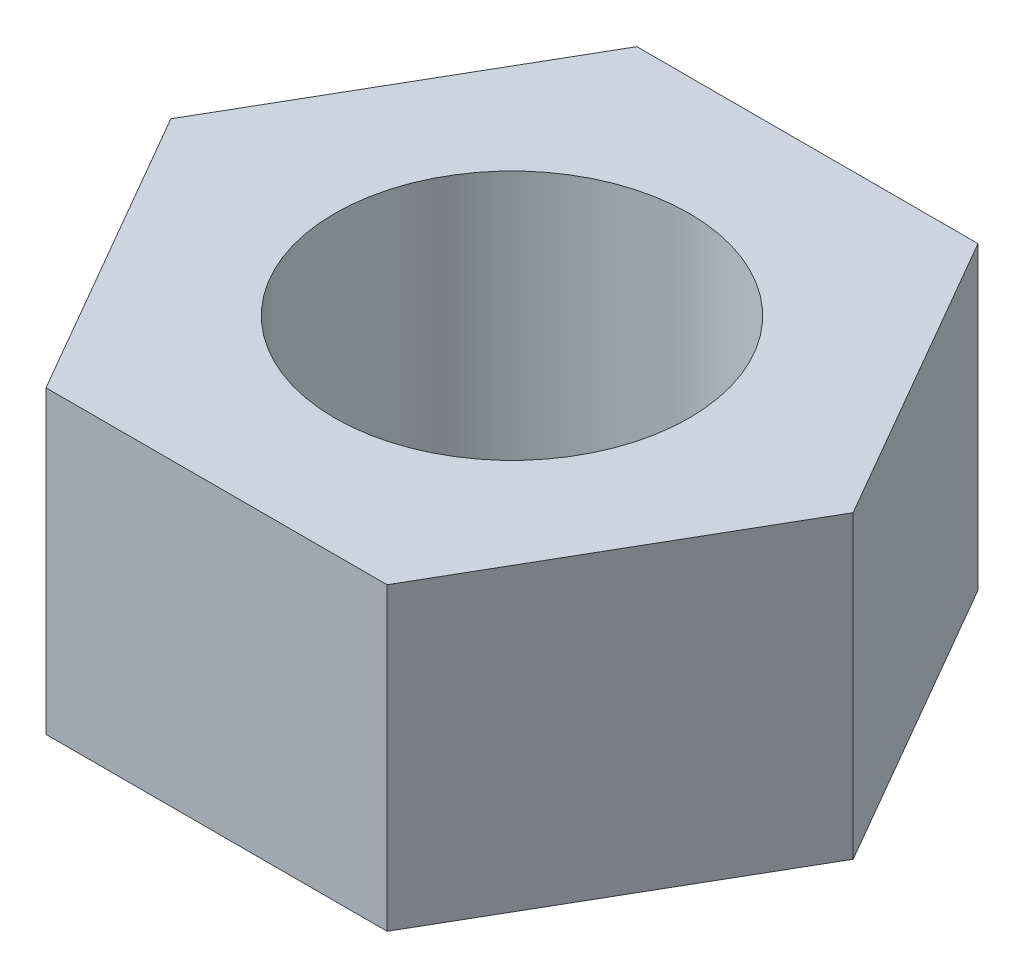
ISO-10303-21;
HEADER;
FILE_DESCRIPTION(('STEP AP214'),'2;1');
FILE_NAME('part.step','',(''),(''),'','','');
FILE_SCHEMA(('AUTOMOTIVE_DESIGN { 1 0 10303 214 1 1 1 1 }'));
ENDSEC;
DATA;
#1=APPLICATION_CONTEXT('core data for automotive mechanical design processes');
#2=APPLICATION_PROTOCOL_DEFINITION('international standard','automotive_design',2000,#1);
#3=PRODUCT_CONTEXT('',#1,'mechanical');
#4=PRODUCT('Part','Part','',(#3));
#5=PRODUCT_RELATED_PRODUCT_CATEGORY('part','',(#4));
#6=PRODUCT_DEFINITION_FORMATION('','',#4);
#7=PRODUCT_DEFINITION_CONTEXT('part definition',#1,'design');
#8=PRODUCT_DEFINITION('design','',#6,#7);
#9=PRODUCT_DEFINITION_SHAPE('','',#8);
#10=(LENGTH_UNIT() NAMED_UNIT(*) SI_UNIT(.MILLI.,.METRE.));
#11=(NAMED_UNIT(*) PLANE_ANGLE_UNIT() SI_UNIT($,.RADIAN.));
#12=(NAMED_UNIT(*) SI_UNIT($,.STERADIAN.) SOLID_ANGLE_UNIT());
#13=UNCERTAINTY_MEASURE_WITH_UNIT(LENGTH_MEASURE(1.E-05),#10,'distance_accuracy_value','');
#14=(GEOMETRIC_REPRESENTATION_CONTEXT(3) GLOBAL_UNCERTAINTY_ASSIGNED_CONTEXT((#13)) GLOBAL_UNIT_ASSIGNED_CONTEXT((#10,
#11,#12)) REPRESENTATION_CONTEXT('',''));
#15=CARTESIAN_POINT('',(0.,0.,0.));
#16=DIRECTION('',(0.,0.,1.));
#17=DIRECTION('',(1.,0.,0.));
#18=AXIS2_PLACEMENT_3D('',#15,#16,#17);
#19=CARTESIAN_POINT('',(5.77349114489087,5.08,0.));
#20=DIRECTION('',(-0.866025403784439,0.,0.5));
#21=DIRECTION('',(0.5,0.,0.866025403784439));
#22=AXIS2_PLACEMENT_3D('',#19,#20,#21);
#23=PLANE('',#22);
#24=DIRECTION('',(-0.5,0.,-0.866025403784439));
#25=VECTOR('',#24,1.);
#26=CARTESIAN_POINT('',(5.77349114489087,0.,0.));
#27=LINE('',#26,#25);
#28=CARTESIAN_POINT('',(5.77349114489087,0.,0.));
#29=VERTEX_POINT('',#28);
#30=CARTESIAN_POINT('',(2.88674557244544,0.,-4.99999));
#31=VERTEX_POINT('',#30);
#32=EDGE_CURVE('E117',#29,#31,#27,.T.);
#33=ORIENTED_EDGE('',*,*,#32,.T.);
#34=DIRECTION('',(0.,-1.,0.));
#35=VECTOR('',#34,1.);
#36=CARTESIAN_POINT('',(2.88674557244544,5.08,-4.99999));
#37=LINE('',#36,#35);
#38=CARTESIAN_POINT('',(2.88674557244544,5.08,-4.99999));
#39=VERTEX_POINT('',#38);
#40=EDGE_CURVE('E11',#39,#31,#37,.T.);
#41=ORIENTED_EDGE('',*,*,#40,.F.);
#42=DIRECTION('',(-0.5,0.,-0.866025403784439));
#43=VECTOR('',#42,1.);
#44=CARTESIAN_POINT('',(5.77349114489087,5.08,0.));
#45=LINE('',#44,#43);
#46=CARTESIAN_POINT('',(5.77349114489087,5.08,0.));
#47=VERTEX_POINT('',#46);
#48=EDGE_CURVE('E128',#47,#39,#45,.T.);
#49=ORIENTED_EDGE('',*,*,#48,.F.);
#50=DIRECTION('',(0.,-1.,0.));
#51=VECTOR('',#50,1.);
#52=CARTESIAN_POINT('',(5.77349114489087,5.08,0.));
#53=LINE('',#52,#51);
#54=EDGE_CURVE('E113',#47,#29,#53,.T.);
#55=ORIENTED_EDGE('',*,*,#54,.T.);
#56=EDGE_LOOP('',(#33,#41,#49,#55));
#57=FACE_BOUND('',#56,.T.);
#58=ADVANCED_FACE('F33',(#57),#23,.F.);
#59=CARTESIAN_POINT('',(2.88674557244544,5.08,-4.99999));
#60=DIRECTION('',(0.,0.,1.));
#61=DIRECTION('',(1.,0.,0.));
#62=AXIS2_PLACEMENT_3D('',#59,#60,#61);
#63=PLANE('',#62);
#64=DIRECTION('',(-1.,0.,0.));
#65=VECTOR('',#64,1.);
#66=CARTESIAN_POINT('',(2.88674557244544,0.,-4.99999));
#67=LINE('',#66,#65);
#68=CARTESIAN_POINT('',(-2.88674557244544,0.,-4.99999));
#69=VERTEX_POINT('',#68);
#70=EDGE_CURVE('E120',#31,#69,#67,.T.);
#71=ORIENTED_EDGE('',*,*,#70,.T.);
#72=DIRECTION('',(0.,-1.,0.));
#73=VECTOR('',#72,1.);
#74=CARTESIAN_POINT('',(-2.88674557244544,5.08,-4.99999));
#75=LINE('',#74,#73);
#76=CARTESIAN_POINT('',(-2.88674557244544,5.08,-4.99999));
#77=VERTEX_POINT('',#76);
#78=EDGE_CURVE('E41',#77,#69,#75,.T.);
#79=ORIENTED_EDGE('',*,*,#78,.F.);
#80=DIRECTION('',(-1.,0.,0.));
#81=VECTOR('',#80,1.);
#82=CARTESIAN_POINT('',(2.88674557244544,5.08,-4.99999));
#83=LINE('',#82,#81);
#84=EDGE_CURVE('E86',#39,#77,#83,.T.);
#85=ORIENTED_EDGE('',*,*,#84,.F.);
#86=ORIENTED_EDGE('',*,*,#40,.T.);
#87=EDGE_LOOP('',(#71,#79,#85,#86));
#88=FACE_BOUND('',#87,.T.);
#89=ADVANCED_FACE('F153',(#88),#63,.F.);
#90=CARTESIAN_POINT('',(-2.88674557244544,5.08,-4.99999));
#91=DIRECTION('',(0.866025403784439,0.,0.5));
#92=DIRECTION('',(0.5,0.,-0.866025403784439));
#93=AXIS2_PLACEMENT_3D('',#90,#91,#92);
#94=PLANE('',#93);
#95=DIRECTION('',(-0.5,0.,0.866025403784439));
#96=VECTOR('',#95,1.);
#97=CARTESIAN_POINT('',(-2.88674557244544,0.,-4.99999));
#98=LINE('',#97,#96);
#99=CARTESIAN_POINT('',(-5.77349114489087,0.,0.));
#100=VERTEX_POINT('',#99);
#101=EDGE_CURVE('E123',#69,#100,#98,.T.);
#102=ORIENTED_EDGE('',*,*,#101,.T.);
#103=DIRECTION('',(0.,-1.,0.));
#104=VECTOR('',#103,1.);
#105=CARTESIAN_POINT('',(-5.77349114489087,5.08,0.));
#106=LINE('',#105,#104);
#107=CARTESIAN_POINT('',(-5.77349114489087,5.08,0.));
#108=VERTEX_POINT('',#107);
#109=EDGE_CURVE('E108',#108,#100,#106,.T.);
#110=ORIENTED_EDGE('',*,*,#109,.F.);
#111=DIRECTION('',(-0.5,0.,0.866025403784439));
#112=VECTOR('',#111,1.);
#113=CARTESIAN_POINT('',(-2.88674557244544,5.08,-4.99999));
#114=LINE('',#113,#112);
#115=EDGE_CURVE('E99',#77,#108,#114,.T.);
#116=ORIENTED_EDGE('',*,*,#115,.F.);
#117=ORIENTED_EDGE('',*,*,#78,.T.);
#118=EDGE_LOOP('',(#102,#110,#116,#117));
#119=FACE_BOUND('',#118,.T.);
#120=ADVANCED_FACE('F134',(#119),#94,.F.);
#121=CARTESIAN_POINT('',(-5.77349114489087,5.08,0.));
#122=DIRECTION('',(0.866025403784439,0.,-0.5));
#123=DIRECTION('',(-0.5,0.,-0.866025403784439));
#124=AXIS2_PLACEMENT_3D('',#121,#122,#123);
#125=PLANE('',#124);
#126=DIRECTION('',(0.5,0.,0.866025403784439));
#127=VECTOR('',#126,1.);
#128=CARTESIAN_POINT('',(-5.77349114489087,0.,0.));
#129=LINE('',#128,#127);
#130=CARTESIAN_POINT('',(-2.88674557244544,0.,4.99999));
#131=VERTEX_POINT('',#130);
#132=EDGE_CURVE('E107',#100,#131,#129,.T.);
#133=ORIENTED_EDGE('',*,*,#132,.T.);
#134=DIRECTION('',(0.,-1.,0.));
#135=VECTOR('',#134,1.);
#136=CARTESIAN_POINT('',(-2.88674557244544,5.08,4.99999));
#137=LINE('',#136,#135);
#138=CARTESIAN_POINT('',(-2.88674557244544,5.08,4.99999));
#139=VERTEX_POINT('',#138);
#140=EDGE_CURVE('E104',#139,#131,#137,.T.);
#141=ORIENTED_EDGE('',*,*,#140,.F.);
#142=DIRECTION('',(0.5,0.,0.866025403784439));
#143=VECTOR('',#142,1.);
#144=CARTESIAN_POINT('',(-5.77349114489087,5.08,0.));
#145=LINE('',#144,#143);
#146=EDGE_CURVE('E93',#108,#139,#145,.T.);
#147=ORIENTED_EDGE('',*,*,#146,.F.);
#148=ORIENTED_EDGE('',*,*,#109,.T.);
#149=EDGE_LOOP('',(#133,#141,#147,#148));
#150=FACE_BOUND('',#149,.T.);
#151=ADVANCED_FACE('F105',(#150),#125,.F.);
#152=CARTESIAN_POINT('',(-2.88674557244544,5.08,4.99999));
#153=DIRECTION('',(0.,0.,-1.));
#154=DIRECTION('',(-1.,0.,0.));
#155=AXIS2_PLACEMENT_3D('',#152,#153,#154);
#156=PLANE('',#155);
#157=DIRECTION('',(1.,0.,0.));
#158=VECTOR('',#157,1.);
#159=CARTESIAN_POINT('',(-2.88674557244544,0.,4.99999));
#160=LINE('',#159,#158);
#161=CARTESIAN_POINT('',(2.88674557244544,0.,4.99999));
#162=VERTEX_POINT('',#161);
#163=EDGE_CURVE('E72',#131,#162,#160,.T.);
#164=ORIENTED_EDGE('',*,*,#163,.T.);
#165=DIRECTION('',(0.,-1.,0.));
#166=VECTOR('',#165,1.);
#167=CARTESIAN_POINT('',(2.88674557244544,5.08,4.99999));
#168=LINE('',#167,#166);
#169=CARTESIAN_POINT('',(2.88674557244544,5.08,4.99999));
#170=VERTEX_POINT('',#169);
#171=EDGE_CURVE('E109',#170,#162,#168,.T.);
#172=ORIENTED_EDGE('',*,*,#171,.F.);
#173=DIRECTION('',(1.,0.,0.));
#174=VECTOR('',#173,1.);
#175=CARTESIAN_POINT('',(-2.88674557244544,5.08,4.99999));
#176=LINE('',#175,#174);
#177=EDGE_CURVE('E97',#139,#170,#176,.T.);
#178=ORIENTED_EDGE('',*,*,#177,.F.);
#179=ORIENTED_EDGE('',*,*,#140,.T.);
#180=EDGE_LOOP('',(#164,#172,#178,#179));
#181=FACE_BOUND('',#180,.T.);
#182=ADVANCED_FACE('F111',(#181),#156,.F.);
#183=CARTESIAN_POINT('',(2.88674557244544,5.08,4.99999));
#184=DIRECTION('',(-0.866025403784439,0.,-0.5));
#185=DIRECTION('',(-0.5,0.,0.866025403784439));
#186=AXIS2_PLACEMENT_3D('',#183,#184,#185);
#187=PLANE('',#186);
#188=DIRECTION('',(0.5,0.,-0.866025403784439));
#189=VECTOR('',#188,1.);
#190=CARTESIAN_POINT('',(2.88674557244544,0.,4.99999));
#191=LINE('',#190,#189);
#192=EDGE_CURVE('E78',#162,#29,#191,.T.);
#193=ORIENTED_EDGE('',*,*,#192,.T.);
#194=ORIENTED_EDGE('',*,*,#54,.F.);
#195=DIRECTION('',(0.5,0.,-0.866025403784439));
#196=VECTOR('',#195,1.);
#197=CARTESIAN_POINT('',(2.88674557244544,5.08,4.99999));
#198=LINE('',#197,#196);
#199=EDGE_CURVE('E49',#170,#47,#198,.T.);
#200=ORIENTED_EDGE('',*,*,#199,.F.);
#201=ORIENTED_EDGE('',*,*,#171,.T.);
#202=EDGE_LOOP('',(#193,#194,#200,#201));
#203=FACE_BOUND('',#202,.T.);
#204=ADVANCED_FACE('F141',(#203),#187,.F.);
#205=CARTESIAN_POINT('',(0.,5.08,0.));
#206=DIRECTION('',(0.,1.,0.));
#207=DIRECTION('',(0.,0.,1.));
#208=AXIS2_PLACEMENT_3D('',#205,#206,#207);
#209=PLANE('',#208);
#210=CARTESIAN_POINT('',(0.,5.08,0.));
#211=DIRECTION('',(0.,1.,0.));
#212=DIRECTION('',(0.,0.,1.));
#213=AXIS2_PLACEMENT_3D('',#210,#211,#212);
#214=CIRCLE('',#213,3.);
#215=CARTESIAN_POINT('',(0.,5.08,3.));
#216=VERTEX_POINT('',#215);
#217=EDGE_CURVE('E208',#216,#216,#214,.T.);
#218=ORIENTED_EDGE('',*,*,#217,.F.);
#219=EDGE_LOOP('',(#218));
#220=FACE_BOUND('',#219,.T.);
#221=ORIENTED_EDGE('',*,*,#48,.T.);
#222=ORIENTED_EDGE('',*,*,#84,.T.);
#223=ORIENTED_EDGE('',*,*,#115,.T.);
#224=ORIENTED_EDGE('',*,*,#146,.T.);
#225=ORIENTED_EDGE('',*,*,#177,.T.);
#226=ORIENTED_EDGE('',*,*,#199,.T.);
#227=EDGE_LOOP('',(#221,#222,#223,#224,#225,#226));
#228=FACE_BOUND('',#227,.T.);
#229=ADVANCED_FACE('F95',(#220,#228),#209,.T.);
#230=CARTESIAN_POINT('',(0.,0.,0.));
#231=DIRECTION('',(0.,1.,0.));
#232=DIRECTION('',(0.,0.,1.));
#233=AXIS2_PLACEMENT_3D('',#230,#231,#232);
#234=PLANE('',#233);
#235=CARTESIAN_POINT('',(0.,0.,0.));
#236=DIRECTION('',(0.,1.,0.));
#237=DIRECTION('',(0.,0.,1.));
#238=AXIS2_PLACEMENT_3D('',#235,#236,#237);
#239=CIRCLE('',#238,3.);
#240=CARTESIAN_POINT('',(0.,0.,3.));
#241=VERTEX_POINT('',#240);
#242=EDGE_CURVE('E121',#241,#241,#239,.T.);
#243=ORIENTED_EDGE('',*,*,#242,.T.);
#244=EDGE_LOOP('',(#243));
#245=FACE_BOUND('',#244,.T.);
#246=ORIENTED_EDGE('',*,*,#32,.F.);
#247=ORIENTED_EDGE('',*,*,#192,.F.);
#248=ORIENTED_EDGE('',*,*,#163,.F.);
#249=ORIENTED_EDGE('',*,*,#132,.F.);
#250=ORIENTED_EDGE('',*,*,#101,.F.);
#251=ORIENTED_EDGE('',*,*,#70,.F.);
#252=EDGE_LOOP('',(#246,#247,#248,#249,#250,#251));
#253=FACE_BOUND('',#252,.T.);
#254=ADVANCED_FACE('F137',(#245,#253),#234,.F.);
#255=CARTESIAN_POINT('',(0.,0.,0.));
#256=DIRECTION('',(0.,1.,0.));
#257=DIRECTION('',(0.,0.,1.));
#258=AXIS2_PLACEMENT_3D('',#255,#256,#257);
#259=CYLINDRICAL_SURFACE('',#258,3.);
#260=ORIENTED_EDGE('',*,*,#242,.F.);
#261=EDGE_LOOP('',(#260));
#262=FACE_BOUND('',#261,.T.);
#263=ORIENTED_EDGE('',*,*,#217,.T.);
#264=EDGE_LOOP('',(#263));
#265=FACE_BOUND('',#264,.T.);
#266=ADVANCED_FACE('F190',(#262,#265),#259,.F.);
#267=CLOSED_SHELL('',(#58,#89,#120,#151,#182,#204,#229,#254,#266));
#268=MANIFOLD_SOLID_BREP('B2',#267);
#269=ADVANCED_BREP_SHAPE_REPRESENTATION('',(#18,#268),#14);
#270=SHAPE_DEFINITION_REPRESENTATION(#9,#269);
ENDSEC;
END-ISO-10303-21;
